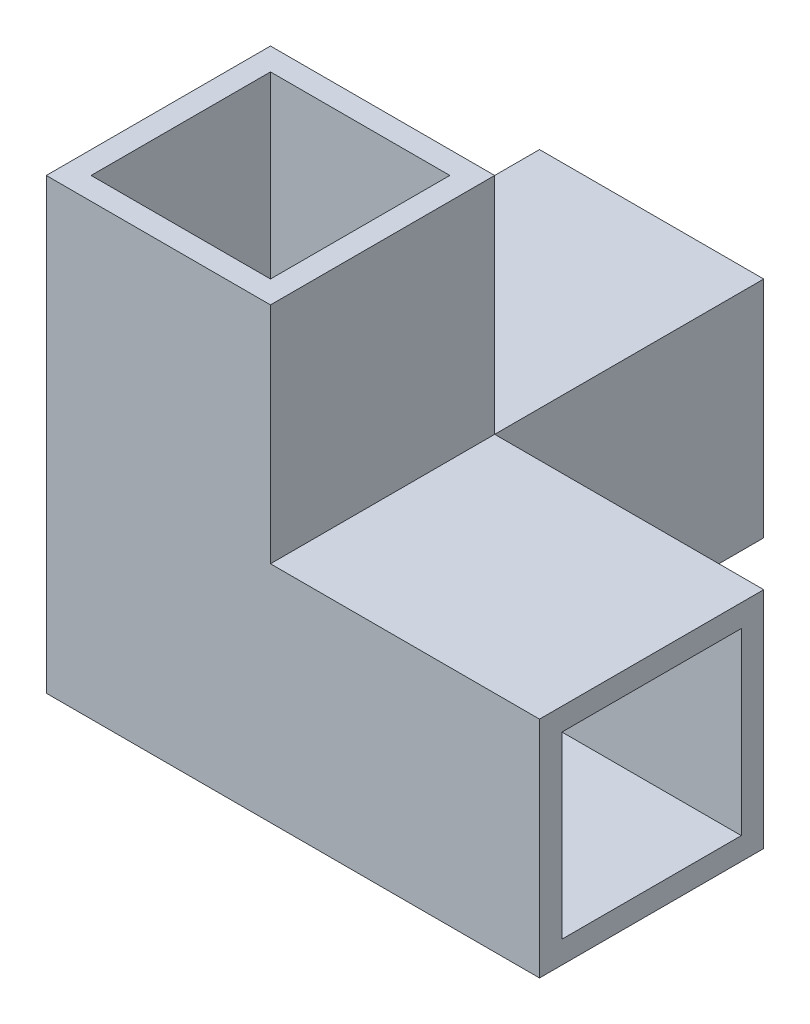
ISO-10303-21;
HEADER;
FILE_DESCRIPTION(('STEP AP214'),'2;1');
FILE_NAME('part.step','',(''),(''),'','','');
FILE_SCHEMA(('AUTOMOTIVE_DESIGN { 1 0 10303 214 1 1 1 1 }'));
ENDSEC;
DATA;
#1=APPLICATION_CONTEXT('core data for automotive mechanical design processes');
#2=APPLICATION_PROTOCOL_DEFINITION('international standard','automotive_design',2000,#1);
#3=PRODUCT_CONTEXT('',#1,'mechanical');
#4=PRODUCT('Part','Part','',(#3));
#5=PRODUCT_RELATED_PRODUCT_CATEGORY('part','',(#4));
#6=PRODUCT_DEFINITION_FORMATION('','',#4);
#7=PRODUCT_DEFINITION_CONTEXT('part definition',#1,'design');
#8=PRODUCT_DEFINITION('design','',#6,#7);
#9=PRODUCT_DEFINITION_SHAPE('','',#8);
#10=(LENGTH_UNIT() NAMED_UNIT(*) SI_UNIT(.MILLI.,.METRE.));
#11=(NAMED_UNIT(*) PLANE_ANGLE_UNIT() SI_UNIT($,.RADIAN.));
#12=(NAMED_UNIT(*) SI_UNIT($,.STERADIAN.) SOLID_ANGLE_UNIT());
#13=UNCERTAINTY_MEASURE_WITH_UNIT(LENGTH_MEASURE(1.E-05),#10,'distance_accuracy_value','');
#14=(GEOMETRIC_REPRESENTATION_CONTEXT(3) GLOBAL_UNCERTAINTY_ASSIGNED_CONTEXT((#13)) GLOBAL_UNIT_ASSIGNED_CONTEXT((#10,
#11,#12)) REPRESENTATION_CONTEXT('',''));
#15=CARTESIAN_POINT('',(0.,0.,0.));
#16=DIRECTION('',(0.,0.,1.));
#17=DIRECTION('',(1.,0.,0.));
#18=AXIS2_PLACEMENT_3D('',#15,#16,#17);
#19=CARTESIAN_POINT('',(-25.,25.,-30.));
#20=DIRECTION('',(0.,0.,1.));
#21=DIRECTION('',(1.,0.,0.));
#22=AXIS2_PLACEMENT_3D('',#19,#20,#21);
#23=PLANE('',#22);
#24=DIRECTION('',(-1.,0.,0.));
#25=VECTOR('',#24,1.);
#26=CARTESIAN_POINT('',(-25.,0.,-30.));
#27=LINE('',#26,#25);
#28=CARTESIAN_POINT('',(0.,0.,-30.));
#29=VERTEX_POINT('',#28);
#30=CARTESIAN_POINT('',(-25.,0.,-30.));
#31=VERTEX_POINT('',#30);
#32=EDGE_CURVE('E317',#29,#31,#27,.T.);
#33=ORIENTED_EDGE('',*,*,#32,.T.);
#34=DIRECTION('',(0.,-1.,0.));
#35=VECTOR('',#34,1.);
#36=CARTESIAN_POINT('',(-25.,25.,-30.));
#37=LINE('',#36,#35);
#38=CARTESIAN_POINT('',(-25.,25.,-30.));
#39=VERTEX_POINT('',#38);
#40=EDGE_CURVE('E48',#39,#31,#37,.T.);
#41=ORIENTED_EDGE('',*,*,#40,.F.);
#42=DIRECTION('',(-1.,0.,0.));
#43=VECTOR('',#42,1.);
#44=CARTESIAN_POINT('',(-25.,25.,-30.));
#45=LINE('',#44,#43);
#46=CARTESIAN_POINT('',(0.,25.,-30.));
#47=VERTEX_POINT('',#46);
#48=EDGE_CURVE('E296',#47,#39,#45,.T.);
#49=ORIENTED_EDGE('',*,*,#48,.F.);
#50=DIRECTION('',(0.,-1.,0.));
#51=VECTOR('',#50,1.);
#52=CARTESIAN_POINT('',(0.,25.,-30.));
#53=LINE('',#52,#51);
#54=EDGE_CURVE('E11',#47,#29,#53,.T.);
#55=ORIENTED_EDGE('',*,*,#54,.T.);
#56=EDGE_LOOP('',(#33,#41,#49,#55));
#57=FACE_BOUND('',#56,.T.);
#58=DIRECTION('',(-1.,0.,0.));
#59=VECTOR('',#58,1.);
#60=CARTESIAN_POINT('',(-25.,2.5,-30.));
#61=LINE('',#60,#59);
#62=CARTESIAN_POINT('',(-2.5,2.5,-30.));
#63=VERTEX_POINT('',#62);
#64=CARTESIAN_POINT('',(-22.5,2.5,-30.));
#65=VERTEX_POINT('',#64);
#66=EDGE_CURVE('E229',#63,#65,#61,.T.);
#67=ORIENTED_EDGE('',*,*,#66,.F.);
#68=DIRECTION('',(0.,-1.,0.));
#69=VECTOR('',#68,1.);
#70=CARTESIAN_POINT('',(-2.5,25.,-30.));
#71=LINE('',#70,#69);
#72=CARTESIAN_POINT('',(-2.5,22.5,-30.));
#73=VERTEX_POINT('',#72);
#74=EDGE_CURVE('E224',#73,#63,#71,.T.);
#75=ORIENTED_EDGE('',*,*,#74,.F.);
#76=DIRECTION('',(-1.,0.,0.));
#77=VECTOR('',#76,1.);
#78=CARTESIAN_POINT('',(-25.,22.5,-30.));
#79=LINE('',#78,#77);
#80=CARTESIAN_POINT('',(-22.5,22.5,-30.));
#81=VERTEX_POINT('',#80);
#82=EDGE_CURVE('E166',#73,#81,#79,.T.);
#83=ORIENTED_EDGE('',*,*,#82,.T.);
#84=DIRECTION('',(0.,-1.,0.));
#85=VECTOR('',#84,1.);
#86=CARTESIAN_POINT('',(-22.5,25.,-30.));
#87=LINE('',#86,#85);
#88=EDGE_CURVE('E228',#81,#65,#87,.T.);
#89=ORIENTED_EDGE('',*,*,#88,.T.);
#90=EDGE_LOOP('',(#67,#75,#83,#89));
#91=FACE_BOUND('',#90,.T.);
#92=ADVANCED_FACE('F39',(#57,#91),#23,.F.);
#93=CARTESIAN_POINT('',(30.,25.,0.));
#94=DIRECTION('',(-1.,0.,0.));
#95=DIRECTION('',(0.,0.,1.));
#96=AXIS2_PLACEMENT_3D('',#93,#94,#95);
#97=PLANE('',#96);
#98=DIRECTION('',(0.,0.,-1.));
#99=VECTOR('',#98,1.);
#100=CARTESIAN_POINT('',(30.,0.,0.));
#101=LINE('',#100,#99);
#102=CARTESIAN_POINT('',(30.,0.,25.));
#103=VERTEX_POINT('',#102);
#104=CARTESIAN_POINT('',(30.,0.,0.));
#105=VERTEX_POINT('',#104);
#106=EDGE_CURVE('E326',#103,#105,#101,.T.);
#107=ORIENTED_EDGE('',*,*,#106,.T.);
#108=DIRECTION('',(0.,-1.,0.));
#109=VECTOR('',#108,1.);
#110=CARTESIAN_POINT('',(30.,25.,0.));
#111=LINE('',#110,#109);
#112=CARTESIAN_POINT('',(30.,25.,0.));
#113=VERTEX_POINT('',#112);
#114=EDGE_CURVE('E334',#113,#105,#111,.T.);
#115=ORIENTED_EDGE('',*,*,#114,.F.);
#116=DIRECTION('',(0.,0.,-1.));
#117=VECTOR('',#116,1.);
#118=CARTESIAN_POINT('',(30.,25.,0.));
#119=LINE('',#118,#117);
#120=CARTESIAN_POINT('',(30.,25.,25.));
#121=VERTEX_POINT('',#120);
#122=EDGE_CURVE('E306',#121,#113,#119,.T.);
#123=ORIENTED_EDGE('',*,*,#122,.F.);
#124=DIRECTION('',(0.,-1.,0.));
#125=VECTOR('',#124,1.);
#126=CARTESIAN_POINT('',(30.,25.,25.));
#127=LINE('',#126,#125);
#128=EDGE_CURVE('E338',#121,#103,#127,.T.);
#129=ORIENTED_EDGE('',*,*,#128,.T.);
#130=EDGE_LOOP('',(#107,#115,#123,#129));
#131=FACE_BOUND('',#130,.T.);
#132=DIRECTION('',(0.,0.,-1.));
#133=VECTOR('',#132,1.);
#134=CARTESIAN_POINT('',(30.,2.5,0.));
#135=LINE('',#134,#133);
#136=CARTESIAN_POINT('',(30.,2.5,22.5));
#137=VERTEX_POINT('',#136);
#138=CARTESIAN_POINT('',(30.,2.5,2.5));
#139=VERTEX_POINT('',#138);
#140=EDGE_CURVE('E245',#137,#139,#135,.T.);
#141=ORIENTED_EDGE('',*,*,#140,.F.);
#142=DIRECTION('',(0.,-1.,0.));
#143=VECTOR('',#142,1.);
#144=CARTESIAN_POINT('',(30.,25.,22.5));
#145=LINE('',#144,#143);
#146=CARTESIAN_POINT('',(30.,22.5,22.5));
#147=VERTEX_POINT('',#146);
#148=EDGE_CURVE('E239',#147,#137,#145,.T.);
#149=ORIENTED_EDGE('',*,*,#148,.F.);
#150=DIRECTION('',(0.,0.,-1.));
#151=VECTOR('',#150,1.);
#152=CARTESIAN_POINT('',(30.,22.5,0.));
#153=LINE('',#152,#151);
#154=CARTESIAN_POINT('',(30.,22.5,2.5));
#155=VERTEX_POINT('',#154);
#156=EDGE_CURVE('E63',#147,#155,#153,.T.);
#157=ORIENTED_EDGE('',*,*,#156,.T.);
#158=DIRECTION('',(0.,-1.,0.));
#159=VECTOR('',#158,1.);
#160=CARTESIAN_POINT('',(30.,25.,2.5));
#161=LINE('',#160,#159);
#162=EDGE_CURVE('E181',#155,#139,#161,.T.);
#163=ORIENTED_EDGE('',*,*,#162,.T.);
#164=EDGE_LOOP('',(#141,#149,#157,#163));
#165=FACE_BOUND('',#164,.T.);
#166=ADVANCED_FACE('F366',(#131,#165),#97,.F.);
#167=CARTESIAN_POINT('',(0.,50.,0.));
#168=DIRECTION('',(0.,-1.,0.));
#169=DIRECTION('',(0.,0.,-1.));
#170=AXIS2_PLACEMENT_3D('',#167,#168,#169);
#171=PLANE('',#170);
#172=DIRECTION('',(0.,0.,1.));
#173=VECTOR('',#172,1.);
#174=CARTESIAN_POINT('',(-25.,50.,25.));
#175=LINE('',#174,#173);
#176=CARTESIAN_POINT('',(-25.,50.,0.));
#177=VERTEX_POINT('',#176);
#178=CARTESIAN_POINT('',(-25.,50.,25.));
#179=VERTEX_POINT('',#178);
#180=EDGE_CURVE('E259',#177,#179,#175,.T.);
#181=ORIENTED_EDGE('',*,*,#180,.T.);
#182=DIRECTION('',(1.,0.,0.));
#183=VECTOR('',#182,1.);
#184=CARTESIAN_POINT('',(-25.,50.,25.));
#185=LINE('',#184,#183);
#186=CARTESIAN_POINT('',(0.,50.,25.));
#187=VERTEX_POINT('',#186);
#188=EDGE_CURVE('E263',#179,#187,#185,.T.);
#189=ORIENTED_EDGE('',*,*,#188,.T.);
#190=DIRECTION('',(0.,0.,-1.));
#191=VECTOR('',#190,1.);
#192=CARTESIAN_POINT('',(0.,50.,25.));
#193=LINE('',#192,#191);
#194=CARTESIAN_POINT('',(0.,50.,0.));
#195=VERTEX_POINT('',#194);
#196=EDGE_CURVE('E267',#187,#195,#193,.T.);
#197=ORIENTED_EDGE('',*,*,#196,.T.);
#198=DIRECTION('',(-1.,0.,0.));
#199=VECTOR('',#198,1.);
#200=CARTESIAN_POINT('',(-25.,50.,0.));
#201=LINE('',#200,#199);
#202=EDGE_CURVE('E270',#195,#177,#201,.T.);
#203=ORIENTED_EDGE('',*,*,#202,.T.);
#204=EDGE_LOOP('',(#181,#189,#197,#203));
#205=FACE_BOUND('',#204,.T.);
#206=DIRECTION('',(0.,0.,1.));
#207=VECTOR('',#206,1.);
#208=CARTESIAN_POINT('',(-22.5,50.,0.));
#209=LINE('',#208,#207);
#210=CARTESIAN_POINT('',(-22.5,50.,2.5));
#211=VERTEX_POINT('',#210);
#212=CARTESIAN_POINT('',(-22.5,50.,22.5));
#213=VERTEX_POINT('',#212);
#214=EDGE_CURVE('E197',#211,#213,#209,.T.);
#215=ORIENTED_EDGE('',*,*,#214,.F.);
#216=DIRECTION('',(-1.,0.,0.));
#217=VECTOR('',#216,1.);
#218=CARTESIAN_POINT('',(0.,50.,2.5));
#219=LINE('',#218,#217);
#220=CARTESIAN_POINT('',(-2.5,50.,2.5));
#221=VERTEX_POINT('',#220);
#222=EDGE_CURVE('E217',#221,#211,#219,.T.);
#223=ORIENTED_EDGE('',*,*,#222,.F.);
#224=DIRECTION('',(0.,0.,-1.));
#225=VECTOR('',#224,1.);
#226=CARTESIAN_POINT('',(-2.5,50.,0.));
#227=LINE('',#226,#225);
#228=CARTESIAN_POINT('',(-2.5,50.,22.5));
#229=VERTEX_POINT('',#228);
#230=EDGE_CURVE('E209',#229,#221,#227,.T.);
#231=ORIENTED_EDGE('',*,*,#230,.F.);
#232=DIRECTION('',(1.,0.,0.));
#233=VECTOR('',#232,1.);
#234=CARTESIAN_POINT('',(0.,50.,22.5));
#235=LINE('',#234,#233);
#236=EDGE_CURVE('E249',#213,#229,#235,.T.);
#237=ORIENTED_EDGE('',*,*,#236,.F.);
#238=EDGE_LOOP('',(#215,#223,#231,#237));
#239=FACE_BOUND('',#238,.T.);
#240=ADVANCED_FACE('F380',(#205,#239),#171,.F.);
#241=CARTESIAN_POINT('',(0.,25.,0.));
#242=DIRECTION('',(0.,1.,0.));
#243=DIRECTION('',(0.,0.,1.));
#244=AXIS2_PLACEMENT_3D('',#241,#242,#243);
#245=PLANE('',#244);
#246=DIRECTION('',(-1.,0.,0.));
#247=VECTOR('',#246,1.);
#248=CARTESIAN_POINT('',(-25.,25.,0.));
#249=LINE('',#248,#247);
#250=CARTESIAN_POINT('',(0.,25.,0.));
#251=VERTEX_POINT('',#250);
#252=CARTESIAN_POINT('',(-25.,25.,0.));
#253=VERTEX_POINT('',#252);
#254=EDGE_CURVE('E264',#251,#253,#249,.T.);
#255=ORIENTED_EDGE('',*,*,#254,.F.);
#256=DIRECTION('',(0.,0.,-1.));
#257=VECTOR('',#256,1.);
#258=CARTESIAN_POINT('',(0.,25.,-30.));
#259=LINE('',#258,#257);
#260=EDGE_CURVE('E292',#251,#47,#259,.T.);
#261=ORIENTED_EDGE('',*,*,#260,.T.);
#262=ORIENTED_EDGE('',*,*,#48,.T.);
#263=DIRECTION('',(0.,0.,1.));
#264=VECTOR('',#263,1.);
#265=CARTESIAN_POINT('',(-25.,25.,25.));
#266=LINE('',#265,#264);
#267=EDGE_CURVE('E300',#39,#253,#266,.T.);
#268=ORIENTED_EDGE('',*,*,#267,.T.);
#269=EDGE_LOOP('',(#255,#261,#262,#268));
#270=FACE_BOUND('',#269,.T.);
#271=ADVANCED_FACE('F387',(#270),#245,.T.);
#272=CARTESIAN_POINT('',(0.,25.,-30.));
#273=DIRECTION('',(-1.,0.,0.));
#274=DIRECTION('',(0.,0.,1.));
#275=AXIS2_PLACEMENT_3D('',#272,#273,#274);
#276=PLANE('',#275);
#277=DIRECTION('',(0.,0.,-1.));
#278=VECTOR('',#277,1.);
#279=CARTESIAN_POINT('',(0.,0.,-30.));
#280=LINE('',#279,#278);
#281=CARTESIAN_POINT('',(0.,0.,0.));
#282=VERTEX_POINT('',#281);
#283=EDGE_CURVE('E291',#282,#29,#280,.T.);
#284=ORIENTED_EDGE('',*,*,#283,.T.);
#285=ORIENTED_EDGE('',*,*,#54,.F.);
#286=ORIENTED_EDGE('',*,*,#260,.F.);
#287=DIRECTION('',(0.,-1.,0.));
#288=VECTOR('',#287,1.);
#289=CARTESIAN_POINT('',(0.,25.,0.));
#290=LINE('',#289,#288);
#291=EDGE_CURVE('E313',#251,#282,#290,.T.);
#292=ORIENTED_EDGE('',*,*,#291,.T.);
#293=EDGE_LOOP('',(#284,#285,#286,#292));
#294=FACE_BOUND('',#293,.T.);
#295=ADVANCED_FACE('F41',(#294),#276,.F.);
#296=CARTESIAN_POINT('',(-25.,25.,25.));
#297=DIRECTION('',(1.,0.,0.));
#298=DIRECTION('',(0.,0.,-1.));
#299=AXIS2_PLACEMENT_3D('',#296,#297,#298);
#300=PLANE('',#299);
#301=DIRECTION('',(0.,0.,1.));
#302=VECTOR('',#301,1.);
#303=CARTESIAN_POINT('',(-25.,0.,25.));
#304=LINE('',#303,#302);
#305=CARTESIAN_POINT('',(-25.,0.,25.));
#306=VERTEX_POINT('',#305);
#307=EDGE_CURVE('E320',#31,#306,#304,.T.);
#308=ORIENTED_EDGE('',*,*,#307,.T.);
#309=DIRECTION('',(0.,-1.,0.));
#310=VECTOR('',#309,1.);
#311=CARTESIAN_POINT('',(-25.,25.,25.));
#312=LINE('',#311,#310);
#313=EDGE_CURVE('E342',#179,#306,#312,.T.);
#314=ORIENTED_EDGE('',*,*,#313,.F.);
#315=ORIENTED_EDGE('',*,*,#180,.F.);
#316=DIRECTION('',(0.,-1.,0.));
#317=VECTOR('',#316,1.);
#318=CARTESIAN_POINT('',(-25.,50.,0.));
#319=LINE('',#318,#317);
#320=EDGE_CURVE('E273',#177,#253,#319,.T.);
#321=ORIENTED_EDGE('',*,*,#320,.T.);
#322=ORIENTED_EDGE('',*,*,#267,.F.);
#323=ORIENTED_EDGE('',*,*,#40,.T.);
#324=EDGE_LOOP('',(#308,#314,#315,#321,#322,#323));
#325=FACE_BOUND('',#324,.T.);
#326=ADVANCED_FACE('F351',(#325),#300,.F.);
#327=CARTESIAN_POINT('',(30.,25.,25.));
#328=DIRECTION('',(0.,0.,-1.));
#329=DIRECTION('',(-1.,0.,0.));
#330=AXIS2_PLACEMENT_3D('',#327,#328,#329);
#331=PLANE('',#330);
#332=DIRECTION('',(1.,0.,0.));
#333=VECTOR('',#332,1.);
#334=CARTESIAN_POINT('',(30.,0.,25.));
#335=LINE('',#334,#333);
#336=EDGE_CURVE('E323',#306,#103,#335,.T.);
#337=ORIENTED_EDGE('',*,*,#336,.T.);
#338=ORIENTED_EDGE('',*,*,#128,.F.);
#339=DIRECTION('',(1.,0.,0.));
#340=VECTOR('',#339,1.);
#341=CARTESIAN_POINT('',(30.,25.,25.));
#342=LINE('',#341,#340);
#343=CARTESIAN_POINT('',(0.,25.,25.));
#344=VERTEX_POINT('',#343);
#345=EDGE_CURVE('E303',#344,#121,#342,.T.);
#346=ORIENTED_EDGE('',*,*,#345,.F.);
#347=DIRECTION('',(0.,-1.,0.));
#348=VECTOR('',#347,1.);
#349=CARTESIAN_POINT('',(0.,50.,25.));
#350=LINE('',#349,#348);
#351=EDGE_CURVE('E287',#187,#344,#350,.T.);
#352=ORIENTED_EDGE('',*,*,#351,.F.);
#353=ORIENTED_EDGE('',*,*,#188,.F.);
#354=ORIENTED_EDGE('',*,*,#313,.T.);
#355=EDGE_LOOP('',(#337,#338,#346,#352,#353,#354));
#356=FACE_BOUND('',#355,.T.);
#357=ADVANCED_FACE('F361',(#356),#331,.F.);
#358=CARTESIAN_POINT('',(0.,25.,0.));
#359=DIRECTION('',(0.,0.,1.));
#360=DIRECTION('',(1.,0.,0.));
#361=AXIS2_PLACEMENT_3D('',#358,#359,#360);
#362=PLANE('',#361);
#363=DIRECTION('',(-1.,0.,0.));
#364=VECTOR('',#363,1.);
#365=CARTESIAN_POINT('',(0.,0.,0.));
#366=LINE('',#365,#364);
#367=EDGE_CURVE('E297',#105,#282,#366,.T.);
#368=ORIENTED_EDGE('',*,*,#367,.T.);
#369=ORIENTED_EDGE('',*,*,#291,.F.);
#370=DIRECTION('',(-1.,0.,0.));
#371=VECTOR('',#370,1.);
#372=CARTESIAN_POINT('',(0.,25.,0.));
#373=LINE('',#372,#371);
#374=EDGE_CURVE('E309',#113,#251,#373,.T.);
#375=ORIENTED_EDGE('',*,*,#374,.F.);
#376=ORIENTED_EDGE('',*,*,#114,.T.);
#377=EDGE_LOOP('',(#368,#369,#375,#376));
#378=FACE_BOUND('',#377,.T.);
#379=ADVANCED_FACE('F393',(#378),#362,.F.);
#380=DIRECTION('',(0.,0.,-1.));
#381=VECTOR('',#380,1.);
#382=CARTESIAN_POINT('',(0.,25.,25.));
#383=LINE('',#382,#381);
#384=EDGE_CURVE('E227',#344,#251,#383,.T.);
#385=ORIENTED_EDGE('',*,*,#384,.F.);
#386=ORIENTED_EDGE('',*,*,#345,.T.);
#387=ORIENTED_EDGE('',*,*,#122,.T.);
#388=ORIENTED_EDGE('',*,*,#374,.T.);
#389=EDGE_LOOP('',(#385,#386,#387,#388));
#390=FACE_BOUND('',#389,.T.);
#391=ADVANCED_FACE('F371',(#390),#245,.T.);
#392=CARTESIAN_POINT('',(0.,0.,0.));
#393=DIRECTION('',(0.,1.,0.));
#394=DIRECTION('',(0.,0.,1.));
#395=AXIS2_PLACEMENT_3D('',#392,#393,#394);
#396=PLANE('',#395);
#397=ORIENTED_EDGE('',*,*,#283,.F.);
#398=ORIENTED_EDGE('',*,*,#367,.F.);
#399=ORIENTED_EDGE('',*,*,#106,.F.);
#400=ORIENTED_EDGE('',*,*,#336,.F.);
#401=ORIENTED_EDGE('',*,*,#307,.F.);
#402=ORIENTED_EDGE('',*,*,#32,.F.);
#403=EDGE_LOOP('',(#397,#398,#399,#400,#401,#402));
#404=FACE_BOUND('',#403,.T.);
#405=ADVANCED_FACE('F356',(#404),#396,.F.);
#406=CARTESIAN_POINT('',(0.,50.,25.));
#407=DIRECTION('',(-1.,0.,0.));
#408=DIRECTION('',(0.,0.,1.));
#409=AXIS2_PLACEMENT_3D('',#406,#407,#408);
#410=PLANE('',#409);
#411=ORIENTED_EDGE('',*,*,#384,.T.);
#412=DIRECTION('',(0.,-1.,0.));
#413=VECTOR('',#412,1.);
#414=CARTESIAN_POINT('',(0.,50.,0.));
#415=LINE('',#414,#413);
#416=EDGE_CURVE('E283',#195,#251,#415,.T.);
#417=ORIENTED_EDGE('',*,*,#416,.F.);
#418=ORIENTED_EDGE('',*,*,#196,.F.);
#419=ORIENTED_EDGE('',*,*,#351,.T.);
#420=EDGE_LOOP('',(#411,#417,#418,#419));
#421=FACE_BOUND('',#420,.T.);
#422=ADVANCED_FACE('F376',(#421),#410,.F.);
#423=CARTESIAN_POINT('',(-25.,50.,0.));
#424=DIRECTION('',(0.,0.,1.));
#425=DIRECTION('',(1.,0.,0.));
#426=AXIS2_PLACEMENT_3D('',#423,#424,#425);
#427=PLANE('',#426);
#428=ORIENTED_EDGE('',*,*,#254,.T.);
#429=ORIENTED_EDGE('',*,*,#320,.F.);
#430=ORIENTED_EDGE('',*,*,#202,.F.);
#431=ORIENTED_EDGE('',*,*,#416,.T.);
#432=EDGE_LOOP('',(#428,#429,#430,#431));
#433=FACE_BOUND('',#432,.T.);
#434=ADVANCED_FACE('F385',(#433),#427,.F.);
#435=CARTESIAN_POINT('',(0.,22.5,0.));
#436=DIRECTION('',(0.,1.,0.));
#437=DIRECTION('',(0.,0.,1.));
#438=AXIS2_PLACEMENT_3D('',#435,#436,#437);
#439=PLANE('',#438);
#440=DIRECTION('',(-1.,0.,0.));
#441=VECTOR('',#440,1.);
#442=CARTESIAN_POINT('',(-25.,22.5,2.5));
#443=LINE('',#442,#441);
#444=CARTESIAN_POINT('',(-2.5,22.5,2.5));
#445=VERTEX_POINT('',#444);
#446=CARTESIAN_POINT('',(-22.5,22.5,2.5));
#447=VERTEX_POINT('',#446);
#448=EDGE_CURVE('E163',#445,#447,#443,.T.);
#449=ORIENTED_EDGE('',*,*,#448,.T.);
#450=DIRECTION('',(0.,0.,1.));
#451=VECTOR('',#450,1.);
#452=CARTESIAN_POINT('',(-22.5,22.5,25.));
#453=LINE('',#452,#451);
#454=EDGE_CURVE('E223',#81,#447,#453,.T.);
#455=ORIENTED_EDGE('',*,*,#454,.F.);
#456=ORIENTED_EDGE('',*,*,#82,.F.);
#457=DIRECTION('',(0.,0.,-1.));
#458=VECTOR('',#457,1.);
#459=CARTESIAN_POINT('',(-2.5,22.5,-30.));
#460=LINE('',#459,#458);
#461=EDGE_CURVE('E55',#445,#73,#460,.T.);
#462=ORIENTED_EDGE('',*,*,#461,.F.);
#463=EDGE_LOOP('',(#449,#455,#456,#462));
#464=FACE_BOUND('',#463,.T.);
#465=ADVANCED_FACE('F160',(#464),#439,.F.);
#466=CARTESIAN_POINT('',(-2.5,25.,-30.));
#467=DIRECTION('',(-1.,0.,0.));
#468=DIRECTION('',(0.,0.,1.));
#469=AXIS2_PLACEMENT_3D('',#466,#467,#468);
#470=PLANE('',#469);
#471=DIRECTION('',(0.,0.,-1.));
#472=VECTOR('',#471,1.);
#473=CARTESIAN_POINT('',(-2.5,2.5,-30.));
#474=LINE('',#473,#472);
#475=CARTESIAN_POINT('',(-2.5,2.5,2.5));
#476=VERTEX_POINT('',#475);
#477=EDGE_CURVE('E177',#476,#63,#474,.T.);
#478=ORIENTED_EDGE('',*,*,#477,.F.);
#479=DIRECTION('',(0.,-1.,0.));
#480=VECTOR('',#479,1.);
#481=CARTESIAN_POINT('',(-2.5,25.,2.5));
#482=LINE('',#481,#480);
#483=EDGE_CURVE('E173',#445,#476,#482,.T.);
#484=ORIENTED_EDGE('',*,*,#483,.F.);
#485=ORIENTED_EDGE('',*,*,#461,.T.);
#486=ORIENTED_EDGE('',*,*,#74,.T.);
#487=EDGE_LOOP('',(#478,#484,#485,#486));
#488=FACE_BOUND('',#487,.T.);
#489=ADVANCED_FACE('F175',(#488),#470,.T.);
#490=CARTESIAN_POINT('',(-22.5,25.,25.));
#491=DIRECTION('',(1.,0.,0.));
#492=DIRECTION('',(0.,0.,-1.));
#493=AXIS2_PLACEMENT_3D('',#490,#491,#492);
#494=PLANE('',#493);
#495=DIRECTION('',(0.,0.,1.));
#496=VECTOR('',#495,1.);
#497=CARTESIAN_POINT('',(-22.5,2.5,25.));
#498=LINE('',#497,#496);
#499=CARTESIAN_POINT('',(-22.5,2.5,22.5));
#500=VERTEX_POINT('',#499);
#501=EDGE_CURVE('E232',#65,#500,#498,.T.);
#502=ORIENTED_EDGE('',*,*,#501,.F.);
#503=ORIENTED_EDGE('',*,*,#88,.F.);
#504=ORIENTED_EDGE('',*,*,#454,.T.);
#505=DIRECTION('',(0.,-1.,0.));
#506=VECTOR('',#505,1.);
#507=CARTESIAN_POINT('',(-22.5,25.,2.5));
#508=LINE('',#507,#506);
#509=EDGE_CURVE('E195',#211,#447,#508,.T.);
#510=ORIENTED_EDGE('',*,*,#509,.F.);
#511=ORIENTED_EDGE('',*,*,#214,.T.);
#512=DIRECTION('',(0.,-1.,0.));
#513=VECTOR('',#512,1.);
#514=CARTESIAN_POINT('',(-22.5,25.,22.5));
#515=LINE('',#514,#513);
#516=EDGE_CURVE('E236',#213,#500,#515,.T.);
#517=ORIENTED_EDGE('',*,*,#516,.T.);
#518=EDGE_LOOP('',(#502,#503,#504,#510,#511,#517));
#519=FACE_BOUND('',#518,.T.);
#520=ADVANCED_FACE('F447',(#519),#494,.T.);
#521=CARTESIAN_POINT('',(30.,25.,22.5));
#522=DIRECTION('',(0.,0.,-1.));
#523=DIRECTION('',(-1.,0.,0.));
#524=AXIS2_PLACEMENT_3D('',#521,#522,#523);
#525=PLANE('',#524);
#526=DIRECTION('',(1.,0.,0.));
#527=VECTOR('',#526,1.);
#528=CARTESIAN_POINT('',(30.,2.5,22.5));
#529=LINE('',#528,#527);
#530=EDGE_CURVE('E248',#500,#137,#529,.T.);
#531=ORIENTED_EDGE('',*,*,#530,.F.);
#532=ORIENTED_EDGE('',*,*,#516,.F.);
#533=ORIENTED_EDGE('',*,*,#236,.T.);
#534=DIRECTION('',(0.,-1.,0.));
#535=VECTOR('',#534,1.);
#536=CARTESIAN_POINT('',(-2.5,50.,22.5));
#537=LINE('',#536,#535);
#538=CARTESIAN_POINT('',(-2.5,22.5,22.5));
#539=VERTEX_POINT('',#538);
#540=EDGE_CURVE('E212',#229,#539,#537,.T.);
#541=ORIENTED_EDGE('',*,*,#540,.T.);
#542=DIRECTION('',(1.,0.,0.));
#543=VECTOR('',#542,1.);
#544=CARTESIAN_POINT('',(30.,22.5,22.5));
#545=LINE('',#544,#543);
#546=EDGE_CURVE('E201',#539,#147,#545,.T.);
#547=ORIENTED_EDGE('',*,*,#546,.T.);
#548=ORIENTED_EDGE('',*,*,#148,.T.);
#549=EDGE_LOOP('',(#531,#532,#533,#541,#547,#548));
#550=FACE_BOUND('',#549,.T.);
#551=ADVANCED_FACE('F444',(#550),#525,.T.);
#552=CARTESIAN_POINT('',(0.,25.,2.5));
#553=DIRECTION('',(0.,0.,1.));
#554=DIRECTION('',(1.,0.,0.));
#555=AXIS2_PLACEMENT_3D('',#552,#553,#554);
#556=PLANE('',#555);
#557=DIRECTION('',(-1.,0.,0.));
#558=VECTOR('',#557,1.);
#559=CARTESIAN_POINT('',(0.,2.5,2.5));
#560=LINE('',#559,#558);
#561=EDGE_CURVE('E169',#139,#476,#560,.T.);
#562=ORIENTED_EDGE('',*,*,#561,.F.);
#563=ORIENTED_EDGE('',*,*,#162,.F.);
#564=DIRECTION('',(-1.,0.,0.));
#565=VECTOR('',#564,1.);
#566=CARTESIAN_POINT('',(0.,22.5,2.5));
#567=LINE('',#566,#565);
#568=EDGE_CURVE('E182',#155,#445,#567,.T.);
#569=ORIENTED_EDGE('',*,*,#568,.T.);
#570=ORIENTED_EDGE('',*,*,#483,.T.);
#571=EDGE_LOOP('',(#562,#563,#569,#570));
#572=FACE_BOUND('',#571,.T.);
#573=ADVANCED_FACE('F184',(#572),#556,.T.);
#574=DIRECTION('',(0.,0.,-1.));
#575=VECTOR('',#574,1.);
#576=CARTESIAN_POINT('',(-2.5,22.5,25.));
#577=LINE('',#576,#575);
#578=EDGE_CURVE('E198',#539,#445,#577,.T.);
#579=ORIENTED_EDGE('',*,*,#578,.T.);
#580=ORIENTED_EDGE('',*,*,#568,.F.);
#581=ORIENTED_EDGE('',*,*,#156,.F.);
#582=ORIENTED_EDGE('',*,*,#546,.F.);
#583=EDGE_LOOP('',(#579,#580,#581,#582));
#584=FACE_BOUND('',#583,.T.);
#585=ADVANCED_FACE('F200',(#584),#439,.F.);
#586=CARTESIAN_POINT('',(0.,2.5,0.));
#587=DIRECTION('',(0.,1.,0.));
#588=DIRECTION('',(0.,0.,1.));
#589=AXIS2_PLACEMENT_3D('',#586,#587,#588);
#590=PLANE('',#589);
#591=ORIENTED_EDGE('',*,*,#477,.T.);
#592=ORIENTED_EDGE('',*,*,#66,.T.);
#593=ORIENTED_EDGE('',*,*,#501,.T.);
#594=ORIENTED_EDGE('',*,*,#530,.T.);
#595=ORIENTED_EDGE('',*,*,#140,.T.);
#596=ORIENTED_EDGE('',*,*,#561,.T.);
#597=EDGE_LOOP('',(#591,#592,#593,#594,#595,#596));
#598=FACE_BOUND('',#597,.T.);
#599=ADVANCED_FACE('F438',(#598),#590,.T.);
#600=CARTESIAN_POINT('',(-2.5,50.,25.));
#601=DIRECTION('',(-1.,0.,0.));
#602=DIRECTION('',(0.,0.,1.));
#603=AXIS2_PLACEMENT_3D('',#600,#601,#602);
#604=PLANE('',#603);
#605=ORIENTED_EDGE('',*,*,#578,.F.);
#606=ORIENTED_EDGE('',*,*,#540,.F.);
#607=ORIENTED_EDGE('',*,*,#230,.T.);
#608=DIRECTION('',(0.,-1.,0.));
#609=VECTOR('',#608,1.);
#610=CARTESIAN_POINT('',(-2.5,50.,2.5));
#611=LINE('',#610,#609);
#612=EDGE_CURVE('E192',#221,#445,#611,.T.);
#613=ORIENTED_EDGE('',*,*,#612,.T.);
#614=EDGE_LOOP('',(#605,#606,#607,#613));
#615=FACE_BOUND('',#614,.T.);
#616=ADVANCED_FACE('F207',(#615),#604,.T.);
#617=CARTESIAN_POINT('',(-25.,50.,2.5));
#618=DIRECTION('',(0.,0.,1.));
#619=DIRECTION('',(1.,0.,0.));
#620=AXIS2_PLACEMENT_3D('',#617,#618,#619);
#621=PLANE('',#620);
#622=ORIENTED_EDGE('',*,*,#448,.F.);
#623=ORIENTED_EDGE('',*,*,#612,.F.);
#624=ORIENTED_EDGE('',*,*,#222,.T.);
#625=ORIENTED_EDGE('',*,*,#509,.T.);
#626=EDGE_LOOP('',(#622,#623,#624,#625));
#627=FACE_BOUND('',#626,.T.);
#628=ADVANCED_FACE('F190',(#627),#621,.T.);
#629=CLOSED_SHELL('',(#92,#166,#240,#271,#295,#326,#357,#379,#391,#405,#422,#434,#465,#489,#520,
#551,#573,#585,#599,#616,#628));
#630=MANIFOLD_SOLID_BREP('B2',#629);
#631=ADVANCED_BREP_SHAPE_REPRESENTATION('',(#18,#630),#14);
#632=SHAPE_DEFINITION_REPRESENTATION(#9,#631);
ENDSEC;
END-ISO-10303-21;
